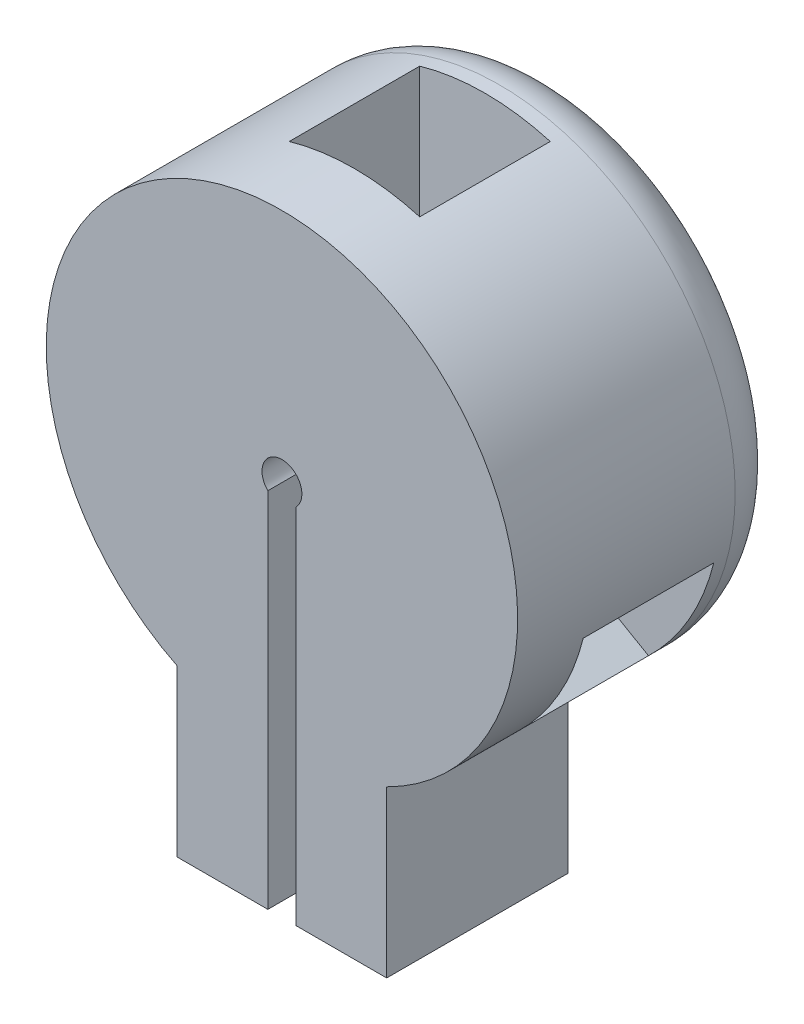
ISO-10303-21;
HEADER;
FILE_DESCRIPTION(('STEP AP214'),'2;1');
FILE_NAME('part.step','',(''),(''),'','','');
FILE_SCHEMA(('AUTOMOTIVE_DESIGN { 1 0 10303 214 1 1 1 1 }'));
ENDSEC;
DATA;
#1=APPLICATION_CONTEXT('core data for automotive mechanical design processes');
#2=APPLICATION_PROTOCOL_DEFINITION('international standard','automotive_design',2000,#1);
#3=PRODUCT_CONTEXT('',#1,'mechanical');
#4=PRODUCT('Part','Part','',(#3));
#5=PRODUCT_RELATED_PRODUCT_CATEGORY('part','',(#4));
#6=PRODUCT_DEFINITION_FORMATION('','',#4);
#7=PRODUCT_DEFINITION_CONTEXT('part definition',#1,'design');
#8=PRODUCT_DEFINITION('design','',#6,#7);
#9=PRODUCT_DEFINITION_SHAPE('','',#8);
#10=(LENGTH_UNIT() NAMED_UNIT(*) SI_UNIT(.MILLI.,.METRE.));
#11=(NAMED_UNIT(*) PLANE_ANGLE_UNIT() SI_UNIT($,.RADIAN.));
#12=(NAMED_UNIT(*) SI_UNIT($,.STERADIAN.) SOLID_ANGLE_UNIT());
#13=UNCERTAINTY_MEASURE_WITH_UNIT(LENGTH_MEASURE(1.E-05),#10,'distance_accuracy_value','');
#14=(GEOMETRIC_REPRESENTATION_CONTEXT(3) GLOBAL_UNCERTAINTY_ASSIGNED_CONTEXT((#13)) GLOBAL_UNIT_ASSIGNED_CONTEXT((#10,
#11,#12)) REPRESENTATION_CONTEXT('',''));
#15=CARTESIAN_POINT('',(0.,0.,0.));
#16=DIRECTION('',(0.,0.,1.));
#17=DIRECTION('',(1.,0.,0.));
#18=AXIS2_PLACEMENT_3D('',#15,#16,#17);
#19=CARTESIAN_POINT('',(0.,0.,10.));
#20=DIRECTION('',(0.,0.,-1.));
#21=DIRECTION('',(-1.,0.,0.));
#22=AXIS2_PLACEMENT_3D('',#19,#20,#21);
#23=CYLINDRICAL_SURFACE('',#22,13.);
#24=CARTESIAN_POINT('',(0.,0.,-1.2));
#25=DIRECTION('',(0.,0.,1.));
#26=DIRECTION('',(0.,-1.,0.));
#27=AXIS2_PLACEMENT_3D('',#24,#25,#26);
#28=CIRCLE('',#27,13.);
#29=CARTESIAN_POINT('',(9.01804048799956,-9.36349004147496,-1.2));
#30=VERTEX_POINT('',#29);
#31=CARTESIAN_POINT('',(12.6180404879996,-3.12810713422704,-1.2));
#32=VERTEX_POINT('',#31);
#33=EDGE_CURVE('E337',#30,#32,#28,.T.);
#34=ORIENTED_EDGE('',*,*,#33,.F.);
#35=DIRECTION('',(0.,0.,-1.));
#36=VECTOR('',#35,1.);
#37=CARTESIAN_POINT('',(9.01804048799956,-9.36349004147496,10.));
#38=LINE('',#37,#36);
#39=CARTESIAN_POINT('',(9.01804048799956,-9.36349004147496,6.));
#40=VERTEX_POINT('',#39);
#41=EDGE_CURVE('E342',#40,#30,#38,.T.);
#42=ORIENTED_EDGE('',*,*,#41,.F.);
#43=CARTESIAN_POINT('',(0.,0.,6.));
#44=DIRECTION('',(0.,0.,1.));
#45=DIRECTION('',(0.,-1.,0.));
#46=AXIS2_PLACEMENT_3D('',#43,#44,#45);
#47=CIRCLE('',#46,13.);
#48=CARTESIAN_POINT('',(12.6180404879996,-3.12810713422704,6.));
#49=VERTEX_POINT('',#48);
#50=EDGE_CURVE('E334',#40,#49,#47,.T.);
#51=ORIENTED_EDGE('',*,*,#50,.T.);
#52=DIRECTION('',(0.,0.,-1.));
#53=VECTOR('',#52,1.);
#54=CARTESIAN_POINT('',(12.6180404879996,-3.12810713422704,10.));
#55=LINE('',#54,#53);
#56=EDGE_CURVE('E339',#49,#32,#55,.T.);
#57=ORIENTED_EDGE('',*,*,#56,.T.);
#58=EDGE_LOOP('',(#34,#42,#51,#57));
#59=FACE_BOUND('',#58,.T.);
#60=DIRECTION('',(0.,0.,-1.));
#61=VECTOR('',#60,1.);
#62=CARTESIAN_POINT('',(5.7778174593052,-11.6454637265739,10.));
#63=LINE('',#62,#61);
#64=CARTESIAN_POINT('',(5.7778174593052,-11.6454637265739,10.));
#65=VERTEX_POINT('',#64);
#66=CARTESIAN_POINT('',(5.7778174593052,-11.6454637265739,0.));
#67=VERTEX_POINT('',#66);
#68=EDGE_CURVE('E304',#65,#67,#63,.T.);
#69=ORIENTED_EDGE('',*,*,#68,.T.);
#70=CARTESIAN_POINT('',(0.,0.,0.));
#71=DIRECTION('',(0.,0.,1.));
#72=DIRECTION('',(1.,0.,0.));
#73=AXIS2_PLACEMENT_3D('',#70,#71,#72);
#74=CIRCLE('',#73,13.);
#75=CARTESIAN_POINT('',(0.7778174593052,-12.9767099065981,0.));
#76=VERTEX_POINT('',#75);
#77=EDGE_CURVE('E253',#76,#67,#74,.T.);
#78=ORIENTED_EDGE('',*,*,#77,.F.);
#79=CARTESIAN_POINT('',(-0.777817459305205,-12.9767099065981,0.));
#80=VERTEX_POINT('',#79);
#81=EDGE_CURVE('E248',#80,#76,#74,.T.);
#82=ORIENTED_EDGE('',*,*,#81,.F.);
#83=CARTESIAN_POINT('',(-5.7778174593052,-11.6454637265739,0.));
#84=VERTEX_POINT('',#83);
#85=EDGE_CURVE('E249',#84,#80,#74,.T.);
#86=ORIENTED_EDGE('',*,*,#85,.F.);
#87=DIRECTION('',(0.,0.,-1.));
#88=VECTOR('',#87,1.);
#89=CARTESIAN_POINT('',(-5.7778174593052,-11.6454637265739,10.));
#90=LINE('',#89,#88);
#91=CARTESIAN_POINT('',(-5.7778174593052,-11.6454637265739,10.));
#92=VERTEX_POINT('',#91);
#93=EDGE_CURVE('E301',#92,#84,#90,.T.);
#94=ORIENTED_EDGE('',*,*,#93,.F.);
#95=CARTESIAN_POINT('',(0.,0.,10.));
#96=DIRECTION('',(0.,0.,1.));
#97=DIRECTION('',(1.,0.,0.));
#98=AXIS2_PLACEMENT_3D('',#95,#96,#97);
#99=CIRCLE('',#98,13.);
#100=EDGE_CURVE('E264',#65,#92,#99,.T.);
#101=ORIENTED_EDGE('',*,*,#100,.F.);
#102=EDGE_LOOP('',(#69,#78,#82,#86,#94,#101));
#103=FACE_BOUND('',#102,.T.);
#104=CARTESIAN_POINT('',(0.,0.,-2.));
#105=DIRECTION('',(0.,0.,1.));
#106=DIRECTION('',(1.,0.,0.));
#107=AXIS2_PLACEMENT_3D('',#104,#105,#106);
#108=CIRCLE('',#107,13.);
#109=CARTESIAN_POINT('',(13.,0.,-2.));
#110=VERTEX_POINT('',#109);
#111=EDGE_CURVE('E319',#110,#110,#108,.T.);
#112=ORIENTED_EDGE('',*,*,#111,.T.);
#113=EDGE_LOOP('',(#112));
#114=FACE_BOUND('',#113,.T.);
#115=CARTESIAN_POINT('',(0.,0.,-1.2));
#116=DIRECTION('',(0.,0.,1.));
#117=DIRECTION('',(0.,-1.,0.));
#118=AXIS2_PLACEMENT_3D('',#115,#116,#117);
#119=CIRCLE('',#118,13.);
#120=CARTESIAN_POINT('',(-12.6180404879997,-3.12810713422687,-1.2));
#121=VERTEX_POINT('',#120);
#122=CARTESIAN_POINT('',(-9.01804048799969,-9.36349004147484,-1.2));
#123=VERTEX_POINT('',#122);
#124=EDGE_CURVE('E325',#121,#123,#119,.T.);
#125=ORIENTED_EDGE('',*,*,#124,.F.);
#126=DIRECTION('',(0.,0.,-1.));
#127=VECTOR('',#126,1.);
#128=CARTESIAN_POINT('',(-12.6180404879997,-3.12810713422687,10.));
#129=LINE('',#128,#127);
#130=CARTESIAN_POINT('',(-12.6180404879997,-3.12810713422687,6.));
#131=VERTEX_POINT('',#130);
#132=EDGE_CURVE('E331',#131,#121,#129,.T.);
#133=ORIENTED_EDGE('',*,*,#132,.F.);
#134=CARTESIAN_POINT('',(0.,0.,6.));
#135=DIRECTION('',(0.,0.,1.));
#136=DIRECTION('',(0.,-1.,0.));
#137=AXIS2_PLACEMENT_3D('',#134,#135,#136);
#138=CIRCLE('',#137,13.);
#139=CARTESIAN_POINT('',(-9.01804048799969,-9.36349004147484,6.));
#140=VERTEX_POINT('',#139);
#141=EDGE_CURVE('E322',#131,#140,#138,.T.);
#142=ORIENTED_EDGE('',*,*,#141,.T.);
#143=DIRECTION('',(0.,0.,-1.));
#144=VECTOR('',#143,1.);
#145=CARTESIAN_POINT('',(-9.01804048799969,-9.36349004147484,10.));
#146=LINE('',#145,#144);
#147=EDGE_CURVE('E328',#140,#123,#146,.T.);
#148=ORIENTED_EDGE('',*,*,#147,.T.);
#149=EDGE_LOOP('',(#125,#133,#142,#148));
#150=FACE_BOUND('',#149,.T.);
#151=CARTESIAN_POINT('',(0.,0.,-1.2));
#152=DIRECTION('',(0.,0.,1.));
#153=DIRECTION('',(1.,0.,0.));
#154=AXIS2_PLACEMENT_3D('',#151,#152,#153);
#155=CIRCLE('',#154,13.);
#156=CARTESIAN_POINT('',(3.60000000000009,12.4915971757017,-1.2));
#157=VERTEX_POINT('',#156);
#158=CARTESIAN_POINT('',(-3.59999999999991,12.4915971757018,-1.2));
#159=VERTEX_POINT('',#158);
#160=EDGE_CURVE('E348',#157,#159,#155,.T.);
#161=ORIENTED_EDGE('',*,*,#160,.F.);
#162=DIRECTION('',(0.,0.,-1.));
#163=VECTOR('',#162,1.);
#164=CARTESIAN_POINT('',(3.60000000000008,12.4915971757017,10.));
#165=LINE('',#164,#163);
#166=CARTESIAN_POINT('',(3.60000000000008,12.4915971757017,6.));
#167=VERTEX_POINT('',#166);
#168=EDGE_CURVE('E11',#167,#157,#165,.T.);
#169=ORIENTED_EDGE('',*,*,#168,.F.);
#170=CARTESIAN_POINT('',(0.,0.,6.));
#171=DIRECTION('',(0.,0.,1.));
#172=DIRECTION('',(1.,0.,0.));
#173=AXIS2_PLACEMENT_3D('',#170,#171,#172);
#174=CIRCLE('',#173,13.);
#175=CARTESIAN_POINT('',(-3.59999999999992,12.4915971757018,6.));
#176=VERTEX_POINT('',#175);
#177=EDGE_CURVE('E345',#167,#176,#174,.T.);
#178=ORIENTED_EDGE('',*,*,#177,.T.);
#179=DIRECTION('',(0.,0.,-1.));
#180=VECTOR('',#179,1.);
#181=CARTESIAN_POINT('',(-3.59999999999992,12.4915971757018,10.));
#182=LINE('',#181,#180);
#183=EDGE_CURVE('E45',#176,#159,#182,.T.);
#184=ORIENTED_EDGE('',*,*,#183,.T.);
#185=EDGE_LOOP('',(#161,#169,#178,#184));
#186=FACE_BOUND('',#185,.T.);
#187=ADVANCED_FACE('F37',(#59,#103,#114,#150,#186),#23,.T.);
#188=CARTESIAN_POINT('',(0.,0.,-2.));
#189=DIRECTION('',(0.,0.,1.));
#190=DIRECTION('',(1.,0.,0.));
#191=AXIS2_PLACEMENT_3D('',#188,#189,#190);
#192=TOROIDAL_SURFACE('',#191,10.,3.);
#193=CARTESIAN_POINT('',(0.,0.,-5.));
#194=DIRECTION('',(0.,0.,1.));
#195=DIRECTION('',(1.,0.,0.));
#196=AXIS2_PLACEMENT_3D('',#193,#194,#195);
#197=CIRCLE('',#196,10.);
#198=CARTESIAN_POINT('',(10.,0.,-5.));
#199=VERTEX_POINT('',#198);
#200=EDGE_CURVE('E316',#199,#199,#197,.F.);
#201=ORIENTED_EDGE('',*,*,#200,.F.);
#202=EDGE_LOOP('',(#201));
#203=FACE_BOUND('',#202,.T.);
#204=ORIENTED_EDGE('',*,*,#111,.F.);
#205=EDGE_LOOP('',(#204));
#206=FACE_BOUND('',#205,.T.);
#207=ADVANCED_FACE('F39',(#203,#206),#192,.T.);
#208=CARTESIAN_POINT('',(0.,0.,0.));
#209=DIRECTION('',(0.,0.,1.));
#210=DIRECTION('',(1.,0.,0.));
#211=AXIS2_PLACEMENT_3D('',#208,#209,#210);
#212=PLANE('',#211);
#213=DIRECTION('',(0.,1.,0.));
#214=VECTOR('',#213,1.);
#215=CARTESIAN_POINT('',(-5.7778174593052,0.,0.));
#216=LINE('',#215,#214);
#217=CARTESIAN_POINT('',(-5.7778174593052,-20.7778174593052,0.));
#218=VERTEX_POINT('',#217);
#219=EDGE_CURVE('E286',#218,#84,#216,.T.);
#220=ORIENTED_EDGE('',*,*,#219,.T.);
#221=ORIENTED_EDGE('',*,*,#85,.T.);
#222=DIRECTION('',(0.,-1.,0.));
#223=VECTOR('',#222,1.);
#224=CARTESIAN_POINT('',(-0.777817459305206,0.,0.));
#225=LINE('',#224,#223);
#226=CARTESIAN_POINT('',(-0.777817459305204,-20.7778174593052,0.));
#227=VERTEX_POINT('',#226);
#228=EDGE_CURVE('E292',#80,#227,#225,.T.);
#229=ORIENTED_EDGE('',*,*,#228,.T.);
#230=DIRECTION('',(-1.,0.,0.));
#231=VECTOR('',#230,1.);
#232=CARTESIAN_POINT('',(0.,-20.7778174593052,0.));
#233=LINE('',#232,#231);
#234=EDGE_CURVE('E289',#227,#218,#233,.T.);
#235=ORIENTED_EDGE('',*,*,#234,.T.);
#236=EDGE_LOOP('',(#220,#221,#229,#235));
#237=FACE_BOUND('',#236,.T.);
#238=ADVANCED_FACE('F373',(#237),#212,.F.);
#239=CARTESIAN_POINT('',(0.,0.,10.));
#240=DIRECTION('',(0.,0.,-1.));
#241=DIRECTION('',(-1.,0.,0.));
#242=AXIS2_PLACEMENT_3D('',#239,#240,#241);
#243=CYLINDRICAL_SURFACE('',#242,1.1);
#244=CARTESIAN_POINT('',(0.,0.,0.));
#245=DIRECTION('',(0.,0.,1.));
#246=DIRECTION('',(1.,0.,0.));
#247=AXIS2_PLACEMENT_3D('',#244,#245,#246);
#248=CIRCLE('',#247,1.1);
#249=CARTESIAN_POINT('',(0.777817459305198,-0.777817459305206,0.));
#250=VERTEX_POINT('',#249);
#251=CARTESIAN_POINT('',(-0.777817459305206,-0.777817459305198,0.));
#252=VERTEX_POINT('',#251);
#253=EDGE_CURVE('E252',#250,#252,#248,.T.);
#254=ORIENTED_EDGE('',*,*,#253,.F.);
#255=DIRECTION('',(0.,0.,-1.));
#256=VECTOR('',#255,1.);
#257=CARTESIAN_POINT('',(0.777817459305198,-0.777817459305206,10.));
#258=LINE('',#257,#256);
#259=CARTESIAN_POINT('',(0.777817459305198,-0.777817459305206,10.));
#260=VERTEX_POINT('',#259);
#261=EDGE_CURVE('E313',#260,#250,#258,.T.);
#262=ORIENTED_EDGE('',*,*,#261,.F.);
#263=CARTESIAN_POINT('',(0.,0.,10.));
#264=DIRECTION('',(0.,0.,1.));
#265=DIRECTION('',(1.,0.,0.));
#266=AXIS2_PLACEMENT_3D('',#263,#264,#265);
#267=CIRCLE('',#266,1.1);
#268=CARTESIAN_POINT('',(-0.777817459305206,-0.777817459305198,10.));
#269=VERTEX_POINT('',#268);
#270=EDGE_CURVE('E254',#260,#269,#267,.T.);
#271=ORIENTED_EDGE('',*,*,#270,.T.);
#272=DIRECTION('',(0.,0.,-1.));
#273=VECTOR('',#272,1.);
#274=CARTESIAN_POINT('',(-0.777817459305206,-0.777817459305198,10.));
#275=LINE('',#274,#273);
#276=EDGE_CURVE('E275',#269,#252,#275,.T.);
#277=ORIENTED_EDGE('',*,*,#276,.T.);
#278=EDGE_LOOP('',(#254,#262,#271,#277));
#279=FACE_BOUND('',#278,.T.);
#280=ADVANCED_FACE('F390',(#279),#243,.F.);
#281=CARTESIAN_POINT('',(0.777817459305198,0.,10.));
#282=DIRECTION('',(1.,0.,0.));
#283=DIRECTION('',(0.,1.,0.));
#284=AXIS2_PLACEMENT_3D('',#281,#282,#283);
#285=PLANE('',#284);
#286=DIRECTION('',(0.,-1.,0.));
#287=VECTOR('',#286,1.);
#288=CARTESIAN_POINT('',(0.777817459305198,0.,0.));
#289=LINE('',#288,#287);
#290=EDGE_CURVE('E278',#250,#76,#289,.T.);
#291=ORIENTED_EDGE('',*,*,#290,.T.);
#292=CARTESIAN_POINT('',(0.777817459305201,-20.7778174593052,0.));
#293=VERTEX_POINT('',#292);
#294=EDGE_CURVE('E277',#76,#293,#289,.T.);
#295=ORIENTED_EDGE('',*,*,#294,.T.);
#296=DIRECTION('',(0.,0.,-1.));
#297=VECTOR('',#296,1.);
#298=CARTESIAN_POINT('',(0.777817459305201,-20.7778174593052,10.));
#299=LINE('',#298,#297);
#300=CARTESIAN_POINT('',(0.777817459305201,-20.7778174593052,10.));
#301=VERTEX_POINT('',#300);
#302=EDGE_CURVE('E310',#301,#293,#299,.T.);
#303=ORIENTED_EDGE('',*,*,#302,.F.);
#304=DIRECTION('',(0.,-1.,0.));
#305=VECTOR('',#304,1.);
#306=CARTESIAN_POINT('',(0.777817459305198,0.,10.));
#307=LINE('',#306,#305);
#308=EDGE_CURVE('E257',#260,#301,#307,.T.);
#309=ORIENTED_EDGE('',*,*,#308,.F.);
#310=ORIENTED_EDGE('',*,*,#261,.T.);
#311=EDGE_LOOP('',(#291,#295,#303,#309,#310));
#312=FACE_BOUND('',#311,.T.);
#313=ADVANCED_FACE('F387',(#312),#285,.F.);
#314=CARTESIAN_POINT('',(0.,-20.7778174593052,10.));
#315=DIRECTION('',(0.,1.,0.));
#316=DIRECTION('',(-1.,0.,0.));
#317=AXIS2_PLACEMENT_3D('',#314,#315,#316);
#318=PLANE('',#317);
#319=DIRECTION('',(1.,0.,0.));
#320=VECTOR('',#319,1.);
#321=CARTESIAN_POINT('',(0.,-20.7778174593052,0.));
#322=LINE('',#321,#320);
#323=CARTESIAN_POINT('',(5.7778174593052,-20.7778174593052,0.));
#324=VERTEX_POINT('',#323);
#325=EDGE_CURVE('E281',#293,#324,#322,.T.);
#326=ORIENTED_EDGE('',*,*,#325,.T.);
#327=DIRECTION('',(0.,0.,-1.));
#328=VECTOR('',#327,1.);
#329=CARTESIAN_POINT('',(5.7778174593052,-20.7778174593052,10.));
#330=LINE('',#329,#328);
#331=CARTESIAN_POINT('',(5.7778174593052,-20.7778174593052,10.));
#332=VERTEX_POINT('',#331);
#333=EDGE_CURVE('E307',#332,#324,#330,.T.);
#334=ORIENTED_EDGE('',*,*,#333,.F.);
#335=DIRECTION('',(1.,0.,0.));
#336=VECTOR('',#335,1.);
#337=CARTESIAN_POINT('',(0.,-20.7778174593052,10.));
#338=LINE('',#337,#336);
#339=EDGE_CURVE('E260',#301,#332,#338,.T.);
#340=ORIENTED_EDGE('',*,*,#339,.F.);
#341=ORIENTED_EDGE('',*,*,#302,.T.);
#342=EDGE_LOOP('',(#326,#334,#340,#341));
#343=FACE_BOUND('',#342,.T.);
#344=ADVANCED_FACE('F383',(#343),#318,.F.);
#345=CARTESIAN_POINT('',(5.7778174593052,0.,10.));
#346=DIRECTION('',(-1.,0.,0.));
#347=DIRECTION('',(0.,0.,1.));
#348=AXIS2_PLACEMENT_3D('',#345,#346,#347);
#349=PLANE('',#348);
#350=DIRECTION('',(0.,1.,0.));
#351=VECTOR('',#350,1.);
#352=CARTESIAN_POINT('',(5.7778174593052,0.,0.));
#353=LINE('',#352,#351);
#354=EDGE_CURVE('E283',#324,#67,#353,.T.);
#355=ORIENTED_EDGE('',*,*,#354,.T.);
#356=ORIENTED_EDGE('',*,*,#68,.F.);
#357=DIRECTION('',(0.,1.,0.));
#358=VECTOR('',#357,1.);
#359=CARTESIAN_POINT('',(5.7778174593052,0.,10.));
#360=LINE('',#359,#358);
#361=EDGE_CURVE('E262',#332,#65,#360,.T.);
#362=ORIENTED_EDGE('',*,*,#361,.F.);
#363=ORIENTED_EDGE('',*,*,#333,.T.);
#364=EDGE_LOOP('',(#355,#356,#362,#363));
#365=FACE_BOUND('',#364,.T.);
#366=ADVANCED_FACE('F380',(#365),#349,.F.);
#367=CARTESIAN_POINT('',(-5.7778174593052,0.,10.));
#368=DIRECTION('',(-1.,0.,0.));
#369=DIRECTION('',(0.,-1.,0.));
#370=AXIS2_PLACEMENT_3D('',#367,#368,#369);
#371=PLANE('',#370);
#372=ORIENTED_EDGE('',*,*,#219,.F.);
#373=DIRECTION('',(0.,0.,-1.));
#374=VECTOR('',#373,1.);
#375=CARTESIAN_POINT('',(-5.7778174593052,-20.7778174593052,10.));
#376=LINE('',#375,#374);
#377=CARTESIAN_POINT('',(-5.7778174593052,-20.7778174593052,10.));
#378=VERTEX_POINT('',#377);
#379=EDGE_CURVE('E299',#378,#218,#376,.T.);
#380=ORIENTED_EDGE('',*,*,#379,.F.);
#381=DIRECTION('',(0.,1.,0.));
#382=VECTOR('',#381,1.);
#383=CARTESIAN_POINT('',(-5.7778174593052,0.,10.));
#384=LINE('',#383,#382);
#385=EDGE_CURVE('E266',#378,#92,#384,.T.);
#386=ORIENTED_EDGE('',*,*,#385,.T.);
#387=ORIENTED_EDGE('',*,*,#93,.T.);
#388=EDGE_LOOP('',(#372,#380,#386,#387));
#389=FACE_BOUND('',#388,.T.);
#390=ADVANCED_FACE('F378',(#389),#371,.T.);
#391=CARTESIAN_POINT('',(0.,-20.7778174593052,10.));
#392=DIRECTION('',(0.,-1.,0.));
#393=DIRECTION('',(0.,0.,-1.));
#394=AXIS2_PLACEMENT_3D('',#391,#392,#393);
#395=PLANE('',#394);
#396=ORIENTED_EDGE('',*,*,#234,.F.);
#397=DIRECTION('',(0.,0.,-1.));
#398=VECTOR('',#397,1.);
#399=CARTESIAN_POINT('',(-0.777817459305204,-20.7778174593052,10.));
#400=LINE('',#399,#398);
#401=CARTESIAN_POINT('',(-0.777817459305204,-20.7778174593052,10.));
#402=VERTEX_POINT('',#401);
#403=EDGE_CURVE('E296',#402,#227,#400,.T.);
#404=ORIENTED_EDGE('',*,*,#403,.F.);
#405=DIRECTION('',(-1.,0.,0.));
#406=VECTOR('',#405,1.);
#407=CARTESIAN_POINT('',(0.,-20.7778174593052,10.));
#408=LINE('',#407,#406);
#409=EDGE_CURVE('E269',#402,#378,#408,.T.);
#410=ORIENTED_EDGE('',*,*,#409,.T.);
#411=ORIENTED_EDGE('',*,*,#379,.T.);
#412=EDGE_LOOP('',(#396,#404,#410,#411));
#413=FACE_BOUND('',#412,.T.);
#414=ADVANCED_FACE('F426',(#413),#395,.T.);
#415=CARTESIAN_POINT('',(-0.777817459305206,0.,10.));
#416=DIRECTION('',(1.,0.,0.));
#417=DIRECTION('',(0.,1.,0.));
#418=AXIS2_PLACEMENT_3D('',#415,#416,#417);
#419=PLANE('',#418);
#420=EDGE_CURVE('E258',#252,#80,#225,.T.);
#421=ORIENTED_EDGE('',*,*,#420,.F.);
#422=ORIENTED_EDGE('',*,*,#276,.F.);
#423=DIRECTION('',(0.,-1.,0.));
#424=VECTOR('',#423,1.);
#425=CARTESIAN_POINT('',(-0.777817459305206,0.,10.));
#426=LINE('',#425,#424);
#427=EDGE_CURVE('E272',#269,#402,#426,.T.);
#428=ORIENTED_EDGE('',*,*,#427,.T.);
#429=ORIENTED_EDGE('',*,*,#403,.T.);
#430=ORIENTED_EDGE('',*,*,#228,.F.);
#431=EDGE_LOOP('',(#421,#422,#428,#429,#430));
#432=FACE_BOUND('',#431,.T.);
#433=ADVANCED_FACE('F417',(#432),#419,.T.);
#434=CARTESIAN_POINT('',(0.,0.,10.));
#435=DIRECTION('',(0.,0.,1.));
#436=DIRECTION('',(1.,0.,0.));
#437=AXIS2_PLACEMENT_3D('',#434,#435,#436);
#438=PLANE('',#437);
#439=ORIENTED_EDGE('',*,*,#270,.F.);
#440=ORIENTED_EDGE('',*,*,#308,.T.);
#441=ORIENTED_EDGE('',*,*,#339,.T.);
#442=ORIENTED_EDGE('',*,*,#361,.T.);
#443=ORIENTED_EDGE('',*,*,#100,.T.);
#444=ORIENTED_EDGE('',*,*,#385,.F.);
#445=ORIENTED_EDGE('',*,*,#409,.F.);
#446=ORIENTED_EDGE('',*,*,#427,.F.);
#447=EDGE_LOOP('',(#439,#440,#441,#442,#443,#444,#445,#446));
#448=FACE_BOUND('',#447,.T.);
#449=ADVANCED_FACE('F413',(#448),#438,.T.);
#450=ORIENTED_EDGE('',*,*,#294,.F.);
#451=ORIENTED_EDGE('',*,*,#77,.T.);
#452=ORIENTED_EDGE('',*,*,#354,.F.);
#453=ORIENTED_EDGE('',*,*,#325,.F.);
#454=EDGE_LOOP('',(#450,#451,#452,#453));
#455=FACE_BOUND('',#454,.T.);
#456=ADVANCED_FACE('F399',(#455),#212,.F.);
#457=CARTESIAN_POINT('',(0.,0.,-5.));
#458=DIRECTION('',(0.,0.,1.));
#459=DIRECTION('',(1.,0.,0.));
#460=AXIS2_PLACEMENT_3D('',#457,#458,#459);
#461=PLANE('',#460);
#462=ORIENTED_EDGE('',*,*,#200,.T.);
#463=EDGE_LOOP('',(#462));
#464=FACE_BOUND('',#463,.T.);
#465=ADVANCED_FACE('F435',(#464),#461,.F.);
#466=CARTESIAN_POINT('',(0.,0.,0.));
#467=DIRECTION('',(0.,0.,1.));
#468=DIRECTION('',(1.,0.,0.));
#469=AXIS2_PLACEMENT_3D('',#466,#467,#468);
#470=PLANE('',#469);
#471=ORIENTED_EDGE('',*,*,#253,.T.);
#472=ORIENTED_EDGE('',*,*,#420,.T.);
#473=ORIENTED_EDGE('',*,*,#81,.T.);
#474=ORIENTED_EDGE('',*,*,#290,.F.);
#475=EDGE_LOOP('',(#471,#472,#473,#474));
#476=FACE_BOUND('',#475,.T.);
#477=ADVANCED_FACE('F404',(#476),#470,.T.);
#478=CARTESIAN_POINT('',(-0.798076211353327,-4.61769145362398,-1.2));
#479=DIRECTION('',(0.,0.,1.));
#480=DIRECTION('',(0.,-1.,0.));
#481=AXIS2_PLACEMENT_3D('',#478,#479,#480);
#482=PLANE('',#481);
#483=DIRECTION('',(-0.86602540378444,-0.499999999999998,0.));
#484=VECTOR('',#483,1.);
#485=CARTESIAN_POINT('',(-4.39807621135331,1.61769145362399,-1.2));
#486=LINE('',#485,#484);
#487=CARTESIAN_POINT('',(-4.39807621135331,1.61769145362399,-1.2));
#488=VERTEX_POINT('',#487);
#489=EDGE_CURVE('E245',#488,#121,#486,.T.);
#490=ORIENTED_EDGE('',*,*,#489,.T.);
#491=ORIENTED_EDGE('',*,*,#124,.T.);
#492=DIRECTION('',(-0.86602540378444,-0.499999999999998,0.));
#493=VECTOR('',#492,1.);
#494=CARTESIAN_POINT('',(-0.798076211353327,-4.61769145362398,-1.2));
#495=LINE('',#494,#493);
#496=CARTESIAN_POINT('',(-0.798076211353327,-4.61769145362398,-1.2));
#497=VERTEX_POINT('',#496);
#498=EDGE_CURVE('E237',#497,#123,#495,.T.);
#499=ORIENTED_EDGE('',*,*,#498,.F.);
#500=DIRECTION('',(-0.499999999999998,0.86602540378444,0.));
#501=VECTOR('',#500,1.);
#502=CARTESIAN_POINT('',(-0.798076211353327,-4.61769145362398,-1.2));
#503=LINE('',#502,#501);
#504=EDGE_CURVE('E200',#497,#488,#503,.T.);
#505=ORIENTED_EDGE('',*,*,#504,.T.);
#506=EDGE_LOOP('',(#490,#491,#499,#505));
#507=FACE_BOUND('',#506,.T.);
#508=ADVANCED_FACE('F441',(#507),#482,.T.);
#509=CARTESIAN_POINT('',(-4.39807621135331,1.61769145362399,-1.2));
#510=DIRECTION('',(0.499999999999998,-0.86602540378444,0.));
#511=DIRECTION('',(0.86602540378444,0.499999999999998,0.));
#512=AXIS2_PLACEMENT_3D('',#509,#510,#511);
#513=PLANE('',#512);
#514=ORIENTED_EDGE('',*,*,#132,.T.);
#515=ORIENTED_EDGE('',*,*,#489,.F.);
#516=DIRECTION('',(0.,0.,1.));
#517=VECTOR('',#516,1.);
#518=CARTESIAN_POINT('',(-4.39807621135331,1.61769145362399,-1.2));
#519=LINE('',#518,#517);
#520=CARTESIAN_POINT('',(-4.39807621135331,1.61769145362399,6.));
#521=VERTEX_POINT('',#520);
#522=EDGE_CURVE('E204',#488,#521,#519,.T.);
#523=ORIENTED_EDGE('',*,*,#522,.T.);
#524=DIRECTION('',(-0.86602540378444,-0.499999999999998,0.));
#525=VECTOR('',#524,1.);
#526=CARTESIAN_POINT('',(-4.39807621135331,1.61769145362399,6.));
#527=LINE('',#526,#525);
#528=EDGE_CURVE('E242',#521,#131,#527,.T.);
#529=ORIENTED_EDGE('',*,*,#528,.T.);
#530=EDGE_LOOP('',(#514,#515,#523,#529));
#531=FACE_BOUND('',#530,.T.);
#532=ADVANCED_FACE('F447',(#531),#513,.T.);
#533=CARTESIAN_POINT('',(-0.798076211353326,-4.61769145362398,6.));
#534=DIRECTION('',(0.,0.,1.));
#535=DIRECTION('',(0.,-1.,0.));
#536=AXIS2_PLACEMENT_3D('',#533,#534,#535);
#537=PLANE('',#536);
#538=ORIENTED_EDGE('',*,*,#528,.F.);
#539=DIRECTION('',(-0.499999999999998,0.86602540378444,0.));
#540=VECTOR('',#539,1.);
#541=CARTESIAN_POINT('',(-0.798076211353326,-4.61769145362398,6.));
#542=LINE('',#541,#540);
#543=CARTESIAN_POINT('',(-0.798076211353326,-4.61769145362398,6.));
#544=VERTEX_POINT('',#543);
#545=EDGE_CURVE('E231',#544,#521,#542,.T.);
#546=ORIENTED_EDGE('',*,*,#545,.F.);
#547=DIRECTION('',(-0.86602540378444,-0.499999999999998,0.));
#548=VECTOR('',#547,1.);
#549=CARTESIAN_POINT('',(-0.798076211353326,-4.61769145362398,6.));
#550=LINE('',#549,#548);
#551=EDGE_CURVE('E239',#544,#140,#550,.T.);
#552=ORIENTED_EDGE('',*,*,#551,.T.);
#553=ORIENTED_EDGE('',*,*,#141,.F.);
#554=EDGE_LOOP('',(#538,#546,#552,#553));
#555=FACE_BOUND('',#554,.T.);
#556=ADVANCED_FACE('F451',(#555),#537,.F.);
#557=CARTESIAN_POINT('',(-0.798076211353327,-4.61769145362398,-1.2));
#558=DIRECTION('',(0.499999999999998,-0.86602540378444,0.));
#559=DIRECTION('',(0.86602540378444,0.499999999999998,0.));
#560=AXIS2_PLACEMENT_3D('',#557,#558,#559);
#561=PLANE('',#560);
#562=ORIENTED_EDGE('',*,*,#551,.F.);
#563=DIRECTION('',(0.,0.,1.));
#564=VECTOR('',#563,1.);
#565=CARTESIAN_POINT('',(-0.798076211353327,-4.61769145362398,-1.2));
#566=LINE('',#565,#564);
#567=EDGE_CURVE('E234',#497,#544,#566,.T.);
#568=ORIENTED_EDGE('',*,*,#567,.F.);
#569=ORIENTED_EDGE('',*,*,#498,.T.);
#570=ORIENTED_EDGE('',*,*,#147,.F.);
#571=EDGE_LOOP('',(#562,#568,#569,#570));
#572=FACE_BOUND('',#571,.T.);
#573=ADVANCED_FACE('F455',(#572),#561,.F.);
#574=CARTESIAN_POINT('',(-2.59807621135332,-1.49999999999999,0.));
#575=DIRECTION('',(0.86602540378444,0.499999999999998,0.));
#576=DIRECTION('',(-0.499999999999998,0.86602540378444,0.));
#577=AXIS2_PLACEMENT_3D('',#574,#575,#576);
#578=PLANE('',#577);
#579=ORIENTED_EDGE('',*,*,#504,.F.);
#580=ORIENTED_EDGE('',*,*,#567,.T.);
#581=ORIENTED_EDGE('',*,*,#545,.T.);
#582=ORIENTED_EDGE('',*,*,#522,.F.);
#583=EDGE_LOOP('',(#579,#580,#581,#582));
#584=FACE_BOUND('',#583,.T.);
#585=ADVANCED_FACE('F459',(#584),#578,.F.);
#586=CARTESIAN_POINT('',(4.39807621135333,1.61769145362393,-1.2));
#587=DIRECTION('',(0.,0.,1.));
#588=DIRECTION('',(0.,-1.,0.));
#589=AXIS2_PLACEMENT_3D('',#586,#587,#588);
#590=PLANE('',#589);
#591=DIRECTION('',(0.866025403784433,-0.50000000000001,0.));
#592=VECTOR('',#591,1.);
#593=CARTESIAN_POINT('',(0.798076211353263,-4.61769145362399,-1.2));
#594=LINE('',#593,#592);
#595=CARTESIAN_POINT('',(0.798076211353263,-4.61769145362399,-1.2));
#596=VERTEX_POINT('',#595);
#597=EDGE_CURVE('E196',#596,#30,#594,.T.);
#598=ORIENTED_EDGE('',*,*,#597,.T.);
#599=ORIENTED_EDGE('',*,*,#33,.T.);
#600=DIRECTION('',(0.866025403784433,-0.50000000000001,0.));
#601=VECTOR('',#600,1.);
#602=CARTESIAN_POINT('',(4.39807621135333,1.61769145362393,-1.2));
#603=LINE('',#602,#601);
#604=CARTESIAN_POINT('',(4.39807621135333,1.61769145362393,-1.2));
#605=VERTEX_POINT('',#604);
#606=EDGE_CURVE('E60',#605,#32,#603,.T.);
#607=ORIENTED_EDGE('',*,*,#606,.F.);
#608=DIRECTION('',(-0.50000000000001,-0.866025403784433,0.));
#609=VECTOR('',#608,1.);
#610=CARTESIAN_POINT('',(4.39807621135333,1.61769145362393,-1.2));
#611=LINE('',#610,#609);
#612=EDGE_CURVE('E210',#605,#596,#611,.T.);
#613=ORIENTED_EDGE('',*,*,#612,.T.);
#614=EDGE_LOOP('',(#598,#599,#607,#613));
#615=FACE_BOUND('',#614,.T.);
#616=ADVANCED_FACE('F463',(#615),#590,.T.);
#617=CARTESIAN_POINT('',(0.798076211353263,-4.61769145362399,-1.2));
#618=DIRECTION('',(0.50000000000001,0.866025403784433,0.));
#619=DIRECTION('',(-0.866025403784433,0.50000000000001,0.));
#620=AXIS2_PLACEMENT_3D('',#617,#618,#619);
#621=PLANE('',#620);
#622=ORIENTED_EDGE('',*,*,#41,.T.);
#623=ORIENTED_EDGE('',*,*,#597,.F.);
#624=DIRECTION('',(0.,0.,1.));
#625=VECTOR('',#624,1.);
#626=CARTESIAN_POINT('',(0.798076211353263,-4.61769145362399,-1.2));
#627=LINE('',#626,#625);
#628=CARTESIAN_POINT('',(0.798076211353263,-4.61769145362399,6.));
#629=VERTEX_POINT('',#628);
#630=EDGE_CURVE('E213',#596,#629,#627,.T.);
#631=ORIENTED_EDGE('',*,*,#630,.T.);
#632=DIRECTION('',(0.866025403784433,-0.50000000000001,0.));
#633=VECTOR('',#632,1.);
#634=CARTESIAN_POINT('',(0.798076211353263,-4.61769145362399,6.));
#635=LINE('',#634,#633);
#636=EDGE_CURVE('E225',#629,#40,#635,.T.);
#637=ORIENTED_EDGE('',*,*,#636,.T.);
#638=EDGE_LOOP('',(#622,#623,#631,#637));
#639=FACE_BOUND('',#638,.T.);
#640=ADVANCED_FACE('F467',(#639),#621,.T.);
#641=CARTESIAN_POINT('',(4.39807621135333,1.61769145362393,6.));
#642=DIRECTION('',(0.,0.,1.));
#643=DIRECTION('',(0.,-1.,0.));
#644=AXIS2_PLACEMENT_3D('',#641,#642,#643);
#645=PLANE('',#644);
#646=ORIENTED_EDGE('',*,*,#636,.F.);
#647=DIRECTION('',(-0.50000000000001,-0.866025403784433,0.));
#648=VECTOR('',#647,1.);
#649=CARTESIAN_POINT('',(4.39807621135333,1.61769145362393,6.));
#650=LINE('',#649,#648);
#651=CARTESIAN_POINT('',(4.39807621135333,1.61769145362393,6.));
#652=VERTEX_POINT('',#651);
#653=EDGE_CURVE('E215',#652,#629,#650,.T.);
#654=ORIENTED_EDGE('',*,*,#653,.F.);
#655=DIRECTION('',(0.866025403784433,-0.50000000000001,0.));
#656=VECTOR('',#655,1.);
#657=CARTESIAN_POINT('',(4.39807621135333,1.61769145362393,6.));
#658=LINE('',#657,#656);
#659=EDGE_CURVE('E222',#652,#49,#658,.T.);
#660=ORIENTED_EDGE('',*,*,#659,.T.);
#661=ORIENTED_EDGE('',*,*,#50,.F.);
#662=EDGE_LOOP('',(#646,#654,#660,#661));
#663=FACE_BOUND('',#662,.T.);
#664=ADVANCED_FACE('F471',(#663),#645,.F.);
#665=CARTESIAN_POINT('',(4.39807621135333,1.61769145362393,-1.2));
#666=DIRECTION('',(0.50000000000001,0.866025403784433,0.));
#667=DIRECTION('',(-0.866025403784433,0.50000000000001,0.));
#668=AXIS2_PLACEMENT_3D('',#665,#666,#667);
#669=PLANE('',#668);
#670=ORIENTED_EDGE('',*,*,#659,.F.);
#671=DIRECTION('',(0.,0.,1.));
#672=VECTOR('',#671,1.);
#673=CARTESIAN_POINT('',(4.39807621135333,1.61769145362393,-1.2));
#674=LINE('',#673,#672);
#675=EDGE_CURVE('E218',#605,#652,#674,.T.);
#676=ORIENTED_EDGE('',*,*,#675,.F.);
#677=ORIENTED_EDGE('',*,*,#606,.T.);
#678=ORIENTED_EDGE('',*,*,#56,.F.);
#679=EDGE_LOOP('',(#670,#676,#677,#678));
#680=FACE_BOUND('',#679,.T.);
#681=ADVANCED_FACE('F475',(#680),#669,.F.);
#682=CARTESIAN_POINT('',(2.5980762113533,-1.50000000000003,0.));
#683=DIRECTION('',(-0.866025403784433,0.50000000000001,0.));
#684=DIRECTION('',(-0.50000000000001,-0.866025403784433,0.));
#685=AXIS2_PLACEMENT_3D('',#682,#683,#684);
#686=PLANE('',#685);
#687=ORIENTED_EDGE('',*,*,#612,.F.);
#688=ORIENTED_EDGE('',*,*,#675,.T.);
#689=ORIENTED_EDGE('',*,*,#653,.T.);
#690=ORIENTED_EDGE('',*,*,#630,.F.);
#691=EDGE_LOOP('',(#687,#688,#689,#690));
#692=FACE_BOUND('',#691,.T.);
#693=ADVANCED_FACE('F479',(#692),#686,.F.);
#694=CARTESIAN_POINT('',(-3.59999999999998,3.00000000000003,-1.2));
#695=DIRECTION('',(0.,0.,1.));
#696=DIRECTION('',(1.,0.,0.));
#697=AXIS2_PLACEMENT_3D('',#694,#695,#696);
#698=PLANE('',#697);
#699=DIRECTION('',(0.,1.,0.));
#700=VECTOR('',#699,1.);
#701=CARTESIAN_POINT('',(3.60000000000002,2.99999999999998,-1.2));
#702=LINE('',#701,#700);
#703=CARTESIAN_POINT('',(3.60000000000002,2.99999999999998,-1.2));
#704=VERTEX_POINT('',#703);
#705=EDGE_CURVE('E195',#704,#157,#702,.T.);
#706=ORIENTED_EDGE('',*,*,#705,.T.);
#707=ORIENTED_EDGE('',*,*,#160,.T.);
#708=DIRECTION('',(0.,1.,0.));
#709=VECTOR('',#708,1.);
#710=CARTESIAN_POINT('',(-3.59999999999998,3.00000000000003,-1.2));
#711=LINE('',#710,#709);
#712=CARTESIAN_POINT('',(-3.59999999999998,3.00000000000003,-1.2));
#713=VERTEX_POINT('',#712);
#714=EDGE_CURVE('E52',#713,#159,#711,.T.);
#715=ORIENTED_EDGE('',*,*,#714,.F.);
#716=DIRECTION('',(1.,0.,0.));
#717=VECTOR('',#716,1.);
#718=CARTESIAN_POINT('',(-3.59999999999998,3.00000000000003,-1.2));
#719=LINE('',#718,#717);
#720=EDGE_CURVE('E184',#713,#704,#719,.T.);
#721=ORIENTED_EDGE('',*,*,#720,.T.);
#722=EDGE_LOOP('',(#706,#707,#715,#721));
#723=FACE_BOUND('',#722,.T.);
#724=ADVANCED_FACE('F194',(#723),#698,.T.);
#725=CARTESIAN_POINT('',(3.60000000000002,2.99999999999998,-1.2));
#726=DIRECTION('',(-1.,0.,0.));
#727=DIRECTION('',(0.,-1.,0.));
#728=AXIS2_PLACEMENT_3D('',#725,#726,#727);
#729=PLANE('',#728);
#730=ORIENTED_EDGE('',*,*,#168,.T.);
#731=ORIENTED_EDGE('',*,*,#705,.F.);
#732=DIRECTION('',(0.,0.,1.));
#733=VECTOR('',#732,1.);
#734=CARTESIAN_POINT('',(3.60000000000002,2.99999999999998,-1.2));
#735=LINE('',#734,#733);
#736=CARTESIAN_POINT('',(3.60000000000002,2.99999999999998,6.));
#737=VERTEX_POINT('',#736);
#738=EDGE_CURVE('E180',#704,#737,#735,.T.);
#739=ORIENTED_EDGE('',*,*,#738,.T.);
#740=DIRECTION('',(0.,1.,0.));
#741=VECTOR('',#740,1.);
#742=CARTESIAN_POINT('',(3.60000000000002,2.99999999999998,6.));
#743=LINE('',#742,#741);
#744=EDGE_CURVE('E201',#737,#167,#743,.T.);
#745=ORIENTED_EDGE('',*,*,#744,.T.);
#746=EDGE_LOOP('',(#730,#731,#739,#745));
#747=FACE_BOUND('',#746,.T.);
#748=ADVANCED_FACE('F198',(#747),#729,.T.);
#749=CARTESIAN_POINT('',(-3.59999999999998,3.00000000000003,6.));
#750=DIRECTION('',(0.,0.,1.));
#751=DIRECTION('',(1.,0.,0.));
#752=AXIS2_PLACEMENT_3D('',#749,#750,#751);
#753=PLANE('',#752);
#754=ORIENTED_EDGE('',*,*,#744,.F.);
#755=DIRECTION('',(1.,0.,0.));
#756=VECTOR('',#755,1.);
#757=CARTESIAN_POINT('',(-3.59999999999998,3.00000000000003,6.));
#758=LINE('',#757,#756);
#759=CARTESIAN_POINT('',(-3.59999999999998,3.00000000000003,6.));
#760=VERTEX_POINT('',#759);
#761=EDGE_CURVE('E186',#760,#737,#758,.T.);
#762=ORIENTED_EDGE('',*,*,#761,.F.);
#763=DIRECTION('',(0.,1.,0.));
#764=VECTOR('',#763,1.);
#765=CARTESIAN_POINT('',(-3.59999999999998,3.00000000000003,6.));
#766=LINE('',#765,#764);
#767=EDGE_CURVE('E206',#760,#176,#766,.T.);
#768=ORIENTED_EDGE('',*,*,#767,.T.);
#769=ORIENTED_EDGE('',*,*,#177,.F.);
#770=EDGE_LOOP('',(#754,#762,#768,#769));
#771=FACE_BOUND('',#770,.T.);
#772=ADVANCED_FACE('F354',(#771),#753,.F.);
#773=CARTESIAN_POINT('',(-3.59999999999998,3.00000000000003,-1.2));
#774=DIRECTION('',(-1.,0.,0.));
#775=DIRECTION('',(0.,-1.,0.));
#776=AXIS2_PLACEMENT_3D('',#773,#774,#775);
#777=PLANE('',#776);
#778=ORIENTED_EDGE('',*,*,#767,.F.);
#779=DIRECTION('',(0.,0.,1.));
#780=VECTOR('',#779,1.);
#781=CARTESIAN_POINT('',(-3.59999999999998,3.00000000000003,-1.2));
#782=LINE('',#781,#780);
#783=EDGE_CURVE('E355',#713,#760,#782,.T.);
#784=ORIENTED_EDGE('',*,*,#783,.F.);
#785=ORIENTED_EDGE('',*,*,#714,.T.);
#786=ORIENTED_EDGE('',*,*,#183,.F.);
#787=EDGE_LOOP('',(#778,#784,#785,#786));
#788=FACE_BOUND('',#787,.T.);
#789=ADVANCED_FACE('F352',(#788),#777,.F.);
#790=CARTESIAN_POINT('',(0.,3.,0.));
#791=DIRECTION('',(0.,-1.,0.));
#792=DIRECTION('',(1.,0.,0.));
#793=AXIS2_PLACEMENT_3D('',#790,#791,#792);
#794=PLANE('',#793);
#795=ORIENTED_EDGE('',*,*,#720,.F.);
#796=ORIENTED_EDGE('',*,*,#783,.T.);
#797=ORIENTED_EDGE('',*,*,#761,.T.);
#798=ORIENTED_EDGE('',*,*,#738,.F.);
#799=EDGE_LOOP('',(#795,#796,#797,#798));
#800=FACE_BOUND('',#799,.T.);
#801=ADVANCED_FACE('F182',(#800),#794,.F.);
#802=CLOSED_SHELL('',(#187,#207,#238,#280,#313,#344,#366,#390,#414,#433,#449,#456,#465,#477,
#508,#532,#556,#573,#585,#616,#640,#664,#681,#693,#724,#748,#772,#789,#801));
#803=MANIFOLD_SOLID_BREP('B2',#802);
#804=ADVANCED_BREP_SHAPE_REPRESENTATION('',(#18,#803),#14);
#805=SHAPE_DEFINITION_REPRESENTATION(#9,#804);
ENDSEC;
END-ISO-10303-21;
